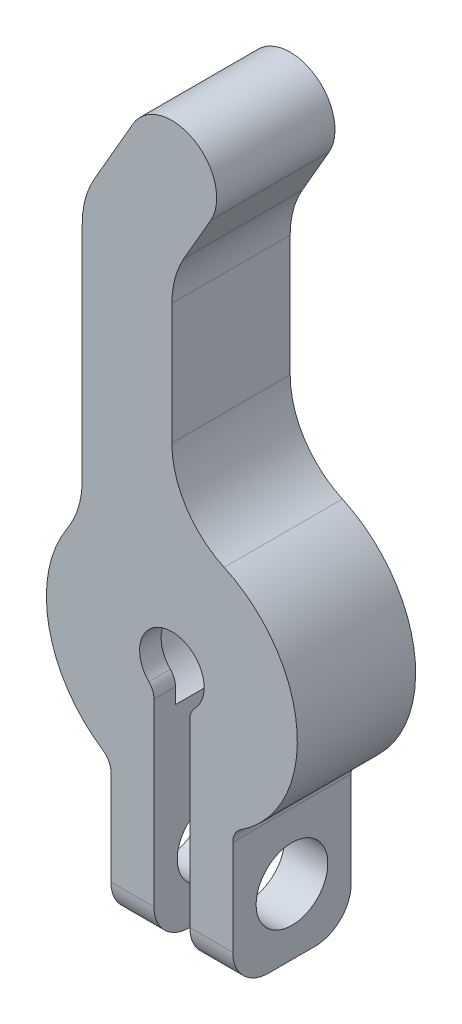
ISO-10303-21;
HEADER;
FILE_DESCRIPTION(('STEP AP214'),'2;1');
FILE_NAME('part.step','',(''),(''),'','','');
FILE_SCHEMA(('AUTOMOTIVE_DESIGN { 1 0 10303 214 1 1 1 1 }'));
ENDSEC;
DATA;
#1=APPLICATION_CONTEXT('core data for automotive mechanical design processes');
#2=APPLICATION_PROTOCOL_DEFINITION('international standard','automotive_design',2000,#1);
#3=PRODUCT_CONTEXT('',#1,'mechanical');
#4=PRODUCT('Part','Part','',(#3));
#5=PRODUCT_RELATED_PRODUCT_CATEGORY('part','',(#4));
#6=PRODUCT_DEFINITION_FORMATION('','',#4);
#7=PRODUCT_DEFINITION_CONTEXT('part definition',#1,'design');
#8=PRODUCT_DEFINITION('design','',#6,#7);
#9=PRODUCT_DEFINITION_SHAPE('','',#8);
#10=(LENGTH_UNIT() NAMED_UNIT(*) SI_UNIT(.MILLI.,.METRE.));
#11=(NAMED_UNIT(*) PLANE_ANGLE_UNIT() SI_UNIT($,.RADIAN.));
#12=(NAMED_UNIT(*) SI_UNIT($,.STERADIAN.) SOLID_ANGLE_UNIT());
#13=UNCERTAINTY_MEASURE_WITH_UNIT(LENGTH_MEASURE(1.E-05),#10,'distance_accuracy_value','');
#14=(GEOMETRIC_REPRESENTATION_CONTEXT(3) GLOBAL_UNCERTAINTY_ASSIGNED_CONTEXT((#13)) GLOBAL_UNIT_ASSIGNED_CONTEXT((#10,
#11,#12)) REPRESENTATION_CONTEXT('',''));
#15=CARTESIAN_POINT('',(0.,0.,0.));
#16=DIRECTION('',(0.,0.,1.));
#17=DIRECTION('',(1.,0.,0.));
#18=AXIS2_PLACEMENT_3D('',#15,#16,#17);
#19=CARTESIAN_POINT('',(0.,0.,2.7));
#20=DIRECTION('',(0.,0.,-1.));
#21=DIRECTION('',(-1.,0.,0.));
#22=AXIS2_PLACEMENT_3D('',#19,#20,#21);
#23=CYLINDRICAL_SURFACE('',#22,1.5);
#24=CARTESIAN_POINT('',(0.,0.,0.));
#25=DIRECTION('',(0.,0.,-1.));
#26=DIRECTION('',(1.,0.,0.));
#27=AXIS2_PLACEMENT_3D('',#24,#25,#26);
#28=CIRCLE('',#27,1.5);
#29=CARTESIAN_POINT('',(-0.5,-1.4142135623731,0.));
#30=VERTEX_POINT('',#29);
#31=CARTESIAN_POINT('',(0.5,-1.4142135623731,0.));
#32=VERTEX_POINT('',#31);
#33=EDGE_CURVE('E273',#30,#32,#28,.T.);
#34=ORIENTED_EDGE('',*,*,#33,.T.);
#35=DIRECTION('',(0.,0.,-1.));
#36=VECTOR('',#35,1.);
#37=CARTESIAN_POINT('',(0.5,-1.4142135623731,2.7));
#38=LINE('',#37,#36);
#39=CARTESIAN_POINT('',(0.5,-1.4142135623731,2.7));
#40=VERTEX_POINT('',#39);
#41=EDGE_CURVE('E329',#40,#32,#38,.T.);
#42=ORIENTED_EDGE('',*,*,#41,.F.);
#43=CARTESIAN_POINT('',(0.,0.,2.7));
#44=DIRECTION('',(0.,0.,-1.));
#45=DIRECTION('',(1.,0.,0.));
#46=AXIS2_PLACEMENT_3D('',#43,#44,#45);
#47=CIRCLE('',#46,1.5);
#48=CARTESIAN_POINT('',(-0.5,-1.4142135623731,2.7));
#49=VERTEX_POINT('',#48);
#50=EDGE_CURVE('E284',#49,#40,#47,.T.);
#51=ORIENTED_EDGE('',*,*,#50,.F.);
#52=DIRECTION('',(0.,0.,-1.));
#53=VECTOR('',#52,1.);
#54=CARTESIAN_POINT('',(-0.5,-1.4142135623731,2.7));
#55=LINE('',#54,#53);
#56=EDGE_CURVE('E287',#49,#30,#55,.T.);
#57=ORIENTED_EDGE('',*,*,#56,.T.);
#58=EDGE_LOOP('',(#34,#42,#51,#57));
#59=FACE_BOUND('',#58,.T.);
#60=ADVANCED_FACE('F38',(#59),#23,.F.);
#61=CARTESIAN_POINT('',(0.5,-1.4142135623731,2.7));
#62=DIRECTION('',(1.,0.,0.));
#63=DIRECTION('',(0.,1.,0.));
#64=AXIS2_PLACEMENT_3D('',#61,#62,#63);
#65=PLANE('',#64);
#66=CARTESIAN_POINT('',(0.5,-5.17032930884901,1.65));
#67=DIRECTION('',(1.,0.,0.));
#68=DIRECTION('',(0.,1.,0.));
#69=AXIS2_PLACEMENT_3D('',#66,#67,#68);
#70=CIRCLE('',#69,1.);
#71=CARTESIAN_POINT('',(0.5,-5.17032930884901,2.65));
#72=VERTEX_POINT('',#71);
#73=EDGE_CURVE('E278',#72,#72,#70,.T.);
#74=ORIENTED_EDGE('',*,*,#73,.T.);
#75=EDGE_LOOP('',(#74));
#76=FACE_BOUND('',#75,.T.);
#77=DIRECTION('',(0.,-1.,0.));
#78=VECTOR('',#77,1.);
#79=CARTESIAN_POINT('',(0.5,-1.4142135623731,0.));
#80=LINE('',#79,#78);
#81=CARTESIAN_POINT('',(0.500000000000001,-6.,0.));
#82=VERTEX_POINT('',#81);
#83=EDGE_CURVE('E291',#32,#82,#80,.T.);
#84=ORIENTED_EDGE('',*,*,#83,.T.);
#85=CARTESIAN_POINT('',(0.500000000000001,-6.,1.));
#86=DIRECTION('',(1.,0.,0.));
#87=DIRECTION('',(0.,1.,0.));
#88=AXIS2_PLACEMENT_3D('',#85,#86,#87);
#89=CIRCLE('',#88,1.);
#90=CARTESIAN_POINT('',(0.500000000000001,-7.,1.));
#91=VERTEX_POINT('',#90);
#92=EDGE_CURVE('E422',#82,#91,#89,.F.);
#93=ORIENTED_EDGE('',*,*,#92,.T.);
#94=DIRECTION('',(0.,0.,-1.));
#95=VECTOR('',#94,1.);
#96=CARTESIAN_POINT('',(0.500000000000001,-7.,2.7));
#97=LINE('',#96,#95);
#98=CARTESIAN_POINT('',(0.500000000000001,-7.,2.3));
#99=VERTEX_POINT('',#98);
#100=EDGE_CURVE('E326',#99,#91,#97,.T.);
#101=ORIENTED_EDGE('',*,*,#100,.F.);
#102=CARTESIAN_POINT('',(0.500000000000001,-6.,2.3));
#103=DIRECTION('',(1.,0.,0.));
#104=DIRECTION('',(0.,1.,0.));
#105=AXIS2_PLACEMENT_3D('',#102,#103,#104);
#106=CIRCLE('',#105,1.);
#107=CARTESIAN_POINT('',(0.5,-6.,3.3));
#108=VERTEX_POINT('',#107);
#109=EDGE_CURVE('E420',#99,#108,#106,.F.);
#110=ORIENTED_EDGE('',*,*,#109,.T.);
#111=DIRECTION('',(0.,-1.,0.));
#112=VECTOR('',#111,1.);
#113=CARTESIAN_POINT('',(0.499999999999999,-0.748331477354789,3.3));
#114=LINE('',#113,#112);
#115=CARTESIAN_POINT('',(0.499999999999999,-0.979795897113272,3.3));
#116=VERTEX_POINT('',#115);
#117=EDGE_CURVE('E271',#116,#108,#114,.T.);
#118=ORIENTED_EDGE('',*,*,#117,.F.);
#119=DIRECTION('',(0.,0.,-1.));
#120=VECTOR('',#119,1.);
#121=CARTESIAN_POINT('',(0.5,-0.979795897113272,2.7));
#122=LINE('',#121,#120);
#123=CARTESIAN_POINT('',(0.499999999999999,-0.979795897113272,2.7));
#124=VERTEX_POINT('',#123);
#125=EDGE_CURVE('E332',#116,#124,#122,.T.);
#126=ORIENTED_EDGE('',*,*,#125,.T.);
#127=DIRECTION('',(0.,-1.,0.));
#128=VECTOR('',#127,1.);
#129=CARTESIAN_POINT('',(0.499999999999999,-0.748331477354789,2.7));
#130=LINE('',#129,#128);
#131=EDGE_CURVE('E281',#124,#40,#130,.T.);
#132=ORIENTED_EDGE('',*,*,#131,.T.);
#133=ORIENTED_EDGE('',*,*,#41,.T.);
#134=EDGE_LOOP('',(#84,#93,#101,#110,#118,#126,#132,#133));
#135=FACE_BOUND('',#134,.T.);
#136=ADVANCED_FACE('F481',(#76,#135),#65,.F.);
#137=CARTESIAN_POINT('',(0.500000000000001,-7.,2.7));
#138=DIRECTION('',(0.,1.,0.));
#139=DIRECTION('',(0.,0.,1.));
#140=AXIS2_PLACEMENT_3D('',#137,#138,#139);
#141=PLANE('',#140);
#142=ORIENTED_EDGE('',*,*,#100,.T.);
#143=DIRECTION('',(1.,0.,0.));
#144=VECTOR('',#143,1.);
#145=CARTESIAN_POINT('',(0.500000000000001,-7.,1.));
#146=LINE('',#145,#144);
#147=CARTESIAN_POINT('',(1.7,-7.,1.));
#148=VERTEX_POINT('',#147);
#149=EDGE_CURVE('E409',#91,#148,#146,.T.);
#150=ORIENTED_EDGE('',*,*,#149,.T.);
#151=DIRECTION('',(0.,0.,-1.));
#152=VECTOR('',#151,1.);
#153=CARTESIAN_POINT('',(1.7,-7.,2.7));
#154=LINE('',#153,#152);
#155=CARTESIAN_POINT('',(1.7,-7.,2.3));
#156=VERTEX_POINT('',#155);
#157=EDGE_CURVE('E247',#156,#148,#154,.T.);
#158=ORIENTED_EDGE('',*,*,#157,.F.);
#159=DIRECTION('',(1.,0.,0.));
#160=VECTOR('',#159,1.);
#161=CARTESIAN_POINT('',(0.500000000000001,-7.,2.3));
#162=LINE('',#161,#160);
#163=EDGE_CURVE('E407',#156,#99,#162,.F.);
#164=ORIENTED_EDGE('',*,*,#163,.T.);
#165=EDGE_LOOP('',(#142,#150,#158,#164));
#166=FACE_BOUND('',#165,.T.);
#167=ADVANCED_FACE('F549',(#166),#141,.F.);
#168=CARTESIAN_POINT('',(1.7,-7.,2.7));
#169=DIRECTION('',(-1.,0.,0.));
#170=DIRECTION('',(0.,0.,1.));
#171=AXIS2_PLACEMENT_3D('',#168,#169,#170);
#172=PLANE('',#171);
#173=CARTESIAN_POINT('',(1.7,-5.17032930884901,1.65));
#174=DIRECTION('',(-1.,0.,0.));
#175=DIRECTION('',(0.,0.,1.));
#176=AXIS2_PLACEMENT_3D('',#173,#174,#175);
#177=CIRCLE('',#176,1.);
#178=CARTESIAN_POINT('',(1.7,-5.17032930884901,2.65));
#179=VERTEX_POINT('',#178);
#180=EDGE_CURVE('E856',#179,#179,#177,.T.);
#181=ORIENTED_EDGE('',*,*,#180,.T.);
#182=EDGE_LOOP('',(#181));
#183=FACE_BOUND('',#182,.T.);
#184=ORIENTED_EDGE('',*,*,#157,.T.);
#185=CARTESIAN_POINT('',(1.7,-6.,1.));
#186=DIRECTION('',(-1.,0.,0.));
#187=DIRECTION('',(0.,0.,1.));
#188=AXIS2_PLACEMENT_3D('',#185,#186,#187);
#189=CIRCLE('',#188,1.);
#190=CARTESIAN_POINT('',(1.7,-6.,0.));
#191=VERTEX_POINT('',#190);
#192=EDGE_CURVE('E414',#148,#191,#189,.F.);
#193=ORIENTED_EDGE('',*,*,#192,.T.);
#194=DIRECTION('',(0.,1.,0.));
#195=VECTOR('',#194,1.);
#196=CARTESIAN_POINT('',(1.7,-7.,0.));
#197=LINE('',#196,#195);
#198=CARTESIAN_POINT('',(1.7,-3.34065861769801,0.));
#199=VERTEX_POINT('',#198);
#200=EDGE_CURVE('E294',#191,#199,#197,.T.);
#201=ORIENTED_EDGE('',*,*,#200,.T.);
#202=DIRECTION('',(0.,0.,1.));
#203=VECTOR('',#202,1.);
#204=CARTESIAN_POINT('',(1.7,-3.34065861769801,3.3));
#205=LINE('',#204,#203);
#206=CARTESIAN_POINT('',(1.7,-3.34065861769801,3.3));
#207=VERTEX_POINT('',#206);
#208=EDGE_CURVE('E390',#199,#207,#205,.T.);
#209=ORIENTED_EDGE('',*,*,#208,.T.);
#210=DIRECTION('',(0.,1.,0.));
#211=VECTOR('',#210,1.);
#212=CARTESIAN_POINT('',(1.7,-7.,3.3));
#213=LINE('',#212,#211);
#214=CARTESIAN_POINT('',(1.7,-6.,3.3));
#215=VERTEX_POINT('',#214);
#216=EDGE_CURVE('E283',#215,#207,#213,.T.);
#217=ORIENTED_EDGE('',*,*,#216,.F.);
#218=CARTESIAN_POINT('',(1.7,-6.,2.3));
#219=DIRECTION('',(-1.,0.,0.));
#220=DIRECTION('',(0.,0.,1.));
#221=AXIS2_PLACEMENT_3D('',#218,#219,#220);
#222=CIRCLE('',#221,1.);
#223=EDGE_CURVE('E412',#215,#156,#222,.F.);
#224=ORIENTED_EDGE('',*,*,#223,.T.);
#225=EDGE_LOOP('',(#184,#193,#201,#209,#217,#224));
#226=FACE_BOUND('',#225,.T.);
#227=ADVANCED_FACE('F490',(#183,#226),#172,.F.);
#228=CARTESIAN_POINT('',(0.,0.,2.7));
#229=DIRECTION('',(0.,0.,-1.));
#230=DIRECTION('',(-1.,0.,0.));
#231=AXIS2_PLACEMENT_3D('',#228,#229,#230);
#232=CYLINDRICAL_SURFACE('',#231,3.5);
#233=CARTESIAN_POINT('',(0.,0.,3.3));
#234=DIRECTION('',(0.,0.,1.));
#235=DIRECTION('',(1.,0.,0.));
#236=AXIS2_PLACEMENT_3D('',#233,#234,#235);
#237=CIRCLE('',#236,3.5);
#238=CARTESIAN_POINT('',(1.925,-2.92307629048576,3.3));
#239=VERTEX_POINT('',#238);
#240=CARTESIAN_POINT('',(1.45833333333333,3.18170770010208,3.3));
#241=VERTEX_POINT('',#240);
#242=EDGE_CURVE('E494',#239,#241,#237,.T.);
#243=ORIENTED_EDGE('',*,*,#242,.F.);
#244=DIRECTION('',(0.,0.,-1.));
#245=VECTOR('',#244,1.);
#246=CARTESIAN_POINT('',(1.925,-2.92307629048576,2.7));
#247=LINE('',#246,#245);
#248=CARTESIAN_POINT('',(1.925,-2.92307629048576,0.));
#249=VERTEX_POINT('',#248);
#250=EDGE_CURVE('E387',#239,#249,#247,.T.);
#251=ORIENTED_EDGE('',*,*,#250,.T.);
#252=CARTESIAN_POINT('',(0.,0.,0.));
#253=DIRECTION('',(0.,0.,1.));
#254=DIRECTION('',(1.,0.,0.));
#255=AXIS2_PLACEMENT_3D('',#252,#253,#254);
#256=CIRCLE('',#255,3.5);
#257=CARTESIAN_POINT('',(1.45833333333333,3.18170770010208,0.));
#258=VERTEX_POINT('',#257);
#259=EDGE_CURVE('E296',#249,#258,#256,.T.);
#260=ORIENTED_EDGE('',*,*,#259,.T.);
#261=DIRECTION('',(0.,0.,-1.));
#262=VECTOR('',#261,1.);
#263=CARTESIAN_POINT('',(1.45833333333333,3.18170770010208,2.7));
#264=LINE('',#263,#262);
#265=EDGE_CURVE('E372',#258,#241,#264,.F.);
#266=ORIENTED_EDGE('',*,*,#265,.T.);
#267=EDGE_LOOP('',(#243,#251,#260,#266));
#268=FACE_BOUND('',#267,.T.);
#269=ADVANCED_FACE('F573',(#268),#232,.T.);
#270=CARTESIAN_POINT('',(0.,9.50000000000001,2.7));
#271=DIRECTION('',(-1.,0.,0.));
#272=DIRECTION('',(0.,0.,1.));
#273=AXIS2_PLACEMENT_3D('',#270,#271,#272);
#274=PLANE('',#273);
#275=DIRECTION('',(0.,1.,0.));
#276=VECTOR('',#275,1.);
#277=CARTESIAN_POINT('',(0.,9.50000000000001,0.));
#278=LINE('',#277,#276);
#279=CARTESIAN_POINT('',(0.,5.45435605731786,0.));
#280=VERTEX_POINT('',#279);
#281=CARTESIAN_POINT('',(0.,8.8301270189222,0.));
#282=VERTEX_POINT('',#281);
#283=EDGE_CURVE('E298',#280,#282,#278,.T.);
#284=ORIENTED_EDGE('',*,*,#283,.T.);
#285=DIRECTION('',(0.,0.,-1.));
#286=VECTOR('',#285,1.);
#287=CARTESIAN_POINT('',(0.,8.8301270189222,3.3));
#288=LINE('',#287,#286);
#289=CARTESIAN_POINT('',(0.,8.8301270189222,3.3));
#290=VERTEX_POINT('',#289);
#291=EDGE_CURVE('E367',#282,#290,#288,.F.);
#292=ORIENTED_EDGE('',*,*,#291,.T.);
#293=DIRECTION('',(0.,1.,0.));
#294=VECTOR('',#293,1.);
#295=CARTESIAN_POINT('',(0.,3.5,3.3));
#296=LINE('',#295,#294);
#297=CARTESIAN_POINT('',(0.,5.45435605731786,3.3));
#298=VERTEX_POINT('',#297);
#299=EDGE_CURVE('E238',#298,#290,#296,.T.);
#300=ORIENTED_EDGE('',*,*,#299,.F.);
#301=DIRECTION('',(0.,0.,1.));
#302=VECTOR('',#301,1.);
#303=CARTESIAN_POINT('',(0.,5.45435605731786,0.));
#304=LINE('',#303,#302);
#305=EDGE_CURVE('E364',#298,#280,#304,.F.);
#306=ORIENTED_EDGE('',*,*,#305,.T.);
#307=EDGE_LOOP('',(#284,#292,#300,#306));
#308=FACE_BOUND('',#307,.T.);
#309=ADVANCED_FACE('F569',(#308),#274,.F.);
#310=CARTESIAN_POINT('',(1.08253175473055,11.375,2.7));
#311=DIRECTION('',(-0.866025403784438,0.500000000000001,0.));
#312=DIRECTION('',(-0.500000000000001,-0.866025403784438,0.));
#313=AXIS2_PLACEMENT_3D('',#310,#311,#312);
#314=PLANE('',#313);
#315=DIRECTION('',(0.500000000000001,0.866025403784438,0.));
#316=VECTOR('',#315,1.);
#317=CARTESIAN_POINT('',(0.,9.50000000000001,3.3));
#318=LINE('',#317,#316);
#319=CARTESIAN_POINT('',(0.334936490538905,10.0801270189222,3.3));
#320=VERTEX_POINT('',#319);
#321=CARTESIAN_POINT('',(1.08253175473055,11.375,3.3));
#322=VERTEX_POINT('',#321);
#323=EDGE_CURVE('E224',#320,#322,#318,.T.);
#324=ORIENTED_EDGE('',*,*,#323,.F.);
#325=DIRECTION('',(0.,0.,-1.));
#326=VECTOR('',#325,1.);
#327=CARTESIAN_POINT('',(0.334936490538904,10.0801270189222,0.));
#328=LINE('',#327,#326);
#329=CARTESIAN_POINT('',(0.334936490538905,10.0801270189222,0.));
#330=VERTEX_POINT('',#329);
#331=EDGE_CURVE('E362',#320,#330,#328,.T.);
#332=ORIENTED_EDGE('',*,*,#331,.T.);
#333=DIRECTION('',(0.500000000000001,0.866025403784438,0.));
#334=VECTOR('',#333,1.);
#335=CARTESIAN_POINT('',(1.08253175473055,11.375,0.));
#336=LINE('',#335,#334);
#337=CARTESIAN_POINT('',(1.08253175473055,11.375,0.));
#338=VERTEX_POINT('',#337);
#339=EDGE_CURVE('E244',#330,#338,#336,.T.);
#340=ORIENTED_EDGE('',*,*,#339,.T.);
#341=DIRECTION('',(0.,0.,-1.));
#342=VECTOR('',#341,1.);
#343=CARTESIAN_POINT('',(1.08253175473055,11.375,2.7));
#344=LINE('',#343,#342);
#345=EDGE_CURVE('E241',#322,#338,#344,.T.);
#346=ORIENTED_EDGE('',*,*,#345,.F.);
#347=EDGE_LOOP('',(#324,#332,#340,#346));
#348=FACE_BOUND('',#347,.T.);
#349=ADVANCED_FACE('F242',(#348),#314,.F.);
#350=CARTESIAN_POINT('',(0.,12.,2.7));
#351=DIRECTION('',(0.,0.,-1.));
#352=DIRECTION('',(-1.,0.,0.));
#353=AXIS2_PLACEMENT_3D('',#350,#351,#352);
#354=CYLINDRICAL_SURFACE('',#353,1.25);
#355=CARTESIAN_POINT('',(0.,12.,0.));
#356=DIRECTION('',(0.,0.,1.));
#357=DIRECTION('',(1.,0.,0.));
#358=AXIS2_PLACEMENT_3D('',#355,#356,#357);
#359=CIRCLE('',#358,1.25);
#360=CARTESIAN_POINT('',(-1.08253175473055,12.625,0.));
#361=VERTEX_POINT('',#360);
#362=EDGE_CURVE('E302',#338,#361,#359,.T.);
#363=ORIENTED_EDGE('',*,*,#362,.T.);
#364=DIRECTION('',(0.,0.,-1.));
#365=VECTOR('',#364,1.);
#366=CARTESIAN_POINT('',(-1.08253175473055,12.625,2.7));
#367=LINE('',#366,#365);
#368=CARTESIAN_POINT('',(-1.08253175473055,12.625,3.3));
#369=VERTEX_POINT('',#368);
#370=EDGE_CURVE('E248',#369,#361,#367,.T.);
#371=ORIENTED_EDGE('',*,*,#370,.F.);
#372=CARTESIAN_POINT('',(0.,12.,3.3));
#373=DIRECTION('',(0.,0.,1.));
#374=DIRECTION('',(1.,0.,0.));
#375=AXIS2_PLACEMENT_3D('',#372,#373,#374);
#376=CIRCLE('',#375,1.25);
#377=EDGE_CURVE('E230',#322,#369,#376,.T.);
#378=ORIENTED_EDGE('',*,*,#377,.F.);
#379=ORIENTED_EDGE('',*,*,#345,.T.);
#380=EDGE_LOOP('',(#363,#371,#378,#379));
#381=FACE_BOUND('',#380,.T.);
#382=ADVANCED_FACE('F250',(#381),#354,.T.);
#383=CARTESIAN_POINT('',(-1.08253175473055,12.625,2.7));
#384=DIRECTION('',(0.866025403784438,-0.500000000000001,0.));
#385=DIRECTION('',(0.500000000000001,0.866025403784438,0.));
#386=AXIS2_PLACEMENT_3D('',#383,#384,#385);
#387=PLANE('',#386);
#388=DIRECTION('',(-0.500000000000001,-0.866025403784438,0.));
#389=VECTOR('',#388,1.);
#390=CARTESIAN_POINT('',(-1.08253175473055,12.625,0.));
#391=LINE('',#390,#389);
#392=CARTESIAN_POINT('',(-2.1650635094611,10.75,0.));
#393=VERTEX_POINT('',#392);
#394=EDGE_CURVE('E304',#361,#393,#391,.T.);
#395=ORIENTED_EDGE('',*,*,#394,.T.);
#396=DIRECTION('',(0.,0.,-1.));
#397=VECTOR('',#396,1.);
#398=CARTESIAN_POINT('',(-2.1650635094611,10.75,2.7));
#399=LINE('',#398,#397);
#400=CARTESIAN_POINT('',(-2.1650635094611,10.75,3.3));
#401=VERTEX_POINT('',#400);
#402=EDGE_CURVE('E358',#393,#401,#399,.F.);
#403=ORIENTED_EDGE('',*,*,#402,.T.);
#404=DIRECTION('',(-0.500000000000001,-0.866025403784438,0.));
#405=VECTOR('',#404,1.);
#406=CARTESIAN_POINT('',(-1.08253175473055,12.625,3.3));
#407=LINE('',#406,#405);
#408=EDGE_CURVE('E252',#369,#401,#407,.T.);
#409=ORIENTED_EDGE('',*,*,#408,.F.);
#410=ORIENTED_EDGE('',*,*,#370,.T.);
#411=EDGE_LOOP('',(#395,#403,#409,#410));
#412=FACE_BOUND('',#411,.T.);
#413=ADVANCED_FACE('F509',(#412),#387,.F.);
#414=CARTESIAN_POINT('',(-2.5,10.1698729810778,2.7));
#415=DIRECTION('',(1.,0.,0.));
#416=DIRECTION('',(0.,1.,0.));
#417=AXIS2_PLACEMENT_3D('',#414,#415,#416);
#418=PLANE('',#417);
#419=DIRECTION('',(0.,-1.,0.));
#420=VECTOR('',#419,1.);
#421=CARTESIAN_POINT('',(-2.5,10.1698729810778,3.3));
#422=LINE('',#421,#420);
#423=CARTESIAN_POINT('',(-2.5,9.50000000000001,3.3));
#424=VERTEX_POINT('',#423);
#425=CARTESIAN_POINT('',(-2.5,3.3166247903554,3.3));
#426=VERTEX_POINT('',#425);
#427=EDGE_CURVE('E254',#424,#426,#422,.T.);
#428=ORIENTED_EDGE('',*,*,#427,.F.);
#429=DIRECTION('',(0.,0.,-1.));
#430=VECTOR('',#429,1.);
#431=CARTESIAN_POINT('',(-2.5,9.50000000000001,2.7));
#432=LINE('',#431,#430);
#433=CARTESIAN_POINT('',(-2.5,9.50000000000001,0.));
#434=VERTEX_POINT('',#433);
#435=EDGE_CURVE('E353',#424,#434,#432,.T.);
#436=ORIENTED_EDGE('',*,*,#435,.T.);
#437=DIRECTION('',(0.,-1.,0.));
#438=VECTOR('',#437,1.);
#439=CARTESIAN_POINT('',(-2.5,10.1698729810778,0.));
#440=LINE('',#439,#438);
#441=CARTESIAN_POINT('',(-2.5,3.3166247903554,0.));
#442=VERTEX_POINT('',#441);
#443=EDGE_CURVE('E307',#434,#442,#440,.T.);
#444=ORIENTED_EDGE('',*,*,#443,.T.);
#445=DIRECTION('',(0.,0.,1.));
#446=VECTOR('',#445,1.);
#447=CARTESIAN_POINT('',(-2.5,3.3166247903554,3.3));
#448=LINE('',#447,#446);
#449=EDGE_CURVE('E351',#442,#426,#448,.T.);
#450=ORIENTED_EDGE('',*,*,#449,.T.);
#451=EDGE_LOOP('',(#428,#436,#444,#450));
#452=FACE_BOUND('',#451,.T.);
#453=ADVANCED_FACE('F518',(#452),#418,.F.);
#454=CARTESIAN_POINT('',(0.,0.,2.7));
#455=DIRECTION('',(0.,0.,-1.));
#456=DIRECTION('',(-1.,0.,0.));
#457=AXIS2_PLACEMENT_3D('',#454,#455,#456);
#458=CYLINDRICAL_SURFACE('',#457,3.5);
#459=CARTESIAN_POINT('',(0.,0.,0.));
#460=DIRECTION('',(0.,0.,1.));
#461=DIRECTION('',(1.,0.,0.));
#462=AXIS2_PLACEMENT_3D('',#459,#460,#461);
#463=CIRCLE('',#462,3.5);
#464=CARTESIAN_POINT('',(-2.91666666666667,1.93469779437398,0.));
#465=VERTEX_POINT('',#464);
#466=CARTESIAN_POINT('',(-1.925,-2.92307629048576,0.));
#467=VERTEX_POINT('',#466);
#468=EDGE_CURVE('E310',#465,#467,#463,.T.);
#469=ORIENTED_EDGE('',*,*,#468,.T.);
#470=DIRECTION('',(0.,0.,-1.));
#471=VECTOR('',#470,1.);
#472=CARTESIAN_POINT('',(-1.925,-2.92307629048576,2.7));
#473=LINE('',#472,#471);
#474=CARTESIAN_POINT('',(-1.925,-2.92307629048576,3.3));
#475=VERTEX_POINT('',#474);
#476=EDGE_CURVE('E396',#467,#475,#473,.F.);
#477=ORIENTED_EDGE('',*,*,#476,.T.);
#478=CARTESIAN_POINT('',(0.,0.,3.3));
#479=DIRECTION('',(0.,0.,1.));
#480=DIRECTION('',(1.,0.,0.));
#481=AXIS2_PLACEMENT_3D('',#478,#479,#480);
#482=CIRCLE('',#481,3.5);
#483=CARTESIAN_POINT('',(-2.91666666666667,1.93469779437398,3.3));
#484=VERTEX_POINT('',#483);
#485=EDGE_CURVE('E260',#484,#475,#482,.T.);
#486=ORIENTED_EDGE('',*,*,#485,.F.);
#487=DIRECTION('',(0.,0.,-1.));
#488=VECTOR('',#487,1.);
#489=CARTESIAN_POINT('',(-2.91666666666667,1.93469779437398,2.7));
#490=LINE('',#489,#488);
#491=EDGE_CURVE('E369',#484,#465,#490,.T.);
#492=ORIENTED_EDGE('',*,*,#491,.T.);
#493=EDGE_LOOP('',(#469,#477,#486,#492));
#494=FACE_BOUND('',#493,.T.);
#495=ADVANCED_FACE('F527',(#494),#458,.T.);
#496=CARTESIAN_POINT('',(-1.7,-7.,2.7));
#497=DIRECTION('',(1.,0.,0.));
#498=DIRECTION('',(0.,0.,-1.));
#499=AXIS2_PLACEMENT_3D('',#496,#497,#498);
#500=PLANE('',#499);
#501=CARTESIAN_POINT('',(-1.7,-5.17032930884901,1.65));
#502=DIRECTION('',(-1.,0.,0.));
#503=DIRECTION('',(0.,0.,1.));
#504=AXIS2_PLACEMENT_3D('',#501,#502,#503);
#505=CIRCLE('',#504,1.);
#506=CARTESIAN_POINT('',(-1.7,-5.17032930884901,2.65));
#507=VERTEX_POINT('',#506);
#508=EDGE_CURVE('E860',#507,#507,#505,.T.);
#509=ORIENTED_EDGE('',*,*,#508,.F.);
#510=EDGE_LOOP('',(#509));
#511=FACE_BOUND('',#510,.T.);
#512=DIRECTION('',(0.,-1.,0.));
#513=VECTOR('',#512,1.);
#514=CARTESIAN_POINT('',(-1.7,-7.,0.));
#515=LINE('',#514,#513);
#516=CARTESIAN_POINT('',(-1.7,-3.34065861769801,0.));
#517=VERTEX_POINT('',#516);
#518=CARTESIAN_POINT('',(-1.7,-6.,0.));
#519=VERTEX_POINT('',#518);
#520=EDGE_CURVE('E313',#517,#519,#515,.T.);
#521=ORIENTED_EDGE('',*,*,#520,.T.);
#522=CARTESIAN_POINT('',(-1.7,-6.,1.));
#523=DIRECTION('',(1.,0.,0.));
#524=DIRECTION('',(0.,0.,-1.));
#525=AXIS2_PLACEMENT_3D('',#522,#523,#524);
#526=CIRCLE('',#525,1.);
#527=CARTESIAN_POINT('',(-1.7,-7.,1.));
#528=VERTEX_POINT('',#527);
#529=EDGE_CURVE('E11',#519,#528,#526,.F.);
#530=ORIENTED_EDGE('',*,*,#529,.T.);
#531=DIRECTION('',(0.,0.,-1.));
#532=VECTOR('',#531,1.);
#533=CARTESIAN_POINT('',(-1.7,-7.,2.7));
#534=LINE('',#533,#532);
#535=CARTESIAN_POINT('',(-1.7,-7.,2.3));
#536=VERTEX_POINT('',#535);
#537=EDGE_CURVE('E321',#536,#528,#534,.T.);
#538=ORIENTED_EDGE('',*,*,#537,.F.);
#539=CARTESIAN_POINT('',(-1.7,-6.,2.3));
#540=DIRECTION('',(1.,0.,0.));
#541=DIRECTION('',(0.,0.,-1.));
#542=AXIS2_PLACEMENT_3D('',#539,#540,#541);
#543=CIRCLE('',#542,1.);
#544=CARTESIAN_POINT('',(-1.7,-6.,3.3));
#545=VERTEX_POINT('',#544);
#546=EDGE_CURVE('E47',#536,#545,#543,.F.);
#547=ORIENTED_EDGE('',*,*,#546,.T.);
#548=DIRECTION('',(0.,-1.,0.));
#549=VECTOR('',#548,1.);
#550=CARTESIAN_POINT('',(-1.7,-3.05941170815567,3.3));
#551=LINE('',#550,#549);
#552=CARTESIAN_POINT('',(-1.7,-3.34065861769801,3.3));
#553=VERTEX_POINT('',#552);
#554=EDGE_CURVE('E263',#553,#545,#551,.T.);
#555=ORIENTED_EDGE('',*,*,#554,.F.);
#556=DIRECTION('',(0.,0.,1.));
#557=VECTOR('',#556,1.);
#558=CARTESIAN_POINT('',(-1.7,-3.34065861769801,0.));
#559=LINE('',#558,#557);
#560=EDGE_CURVE('E393',#553,#517,#559,.F.);
#561=ORIENTED_EDGE('',*,*,#560,.T.);
#562=EDGE_LOOP('',(#521,#530,#538,#547,#555,#561));
#563=FACE_BOUND('',#562,.T.);
#564=ADVANCED_FACE('F440',(#511,#563),#500,.F.);
#565=CARTESIAN_POINT('',(-0.500000000000001,-7.,2.7));
#566=DIRECTION('',(0.,1.,0.));
#567=DIRECTION('',(0.,0.,1.));
#568=AXIS2_PLACEMENT_3D('',#565,#566,#567);
#569=PLANE('',#568);
#570=ORIENTED_EDGE('',*,*,#537,.T.);
#571=DIRECTION('',(1.,0.,0.));
#572=VECTOR('',#571,1.);
#573=CARTESIAN_POINT('',(-0.500000000000001,-7.,1.));
#574=LINE('',#573,#572);
#575=CARTESIAN_POINT('',(-0.500000000000001,-7.,1.));
#576=VERTEX_POINT('',#575);
#577=EDGE_CURVE('E431',#528,#576,#574,.T.);
#578=ORIENTED_EDGE('',*,*,#577,.T.);
#579=DIRECTION('',(0.,0.,-1.));
#580=VECTOR('',#579,1.);
#581=CARTESIAN_POINT('',(-0.500000000000001,-7.,2.7));
#582=LINE('',#581,#580);
#583=CARTESIAN_POINT('',(-0.500000000000001,-7.,2.3));
#584=VERTEX_POINT('',#583);
#585=EDGE_CURVE('E318',#584,#576,#582,.T.);
#586=ORIENTED_EDGE('',*,*,#585,.F.);
#587=DIRECTION('',(1.,0.,0.));
#588=VECTOR('',#587,1.);
#589=CARTESIAN_POINT('',(-1.7,-7.,2.3));
#590=LINE('',#589,#588);
#591=EDGE_CURVE('E59',#584,#536,#590,.F.);
#592=ORIENTED_EDGE('',*,*,#591,.T.);
#593=EDGE_LOOP('',(#570,#578,#586,#592));
#594=FACE_BOUND('',#593,.T.);
#595=ADVANCED_FACE('F448',(#594),#569,.F.);
#596=CARTESIAN_POINT('',(-0.5,-1.4142135623731,2.7));
#597=DIRECTION('',(-1.,0.,0.));
#598=DIRECTION('',(0.,-1.,0.));
#599=AXIS2_PLACEMENT_3D('',#596,#597,#598);
#600=PLANE('',#599);
#601=CARTESIAN_POINT('',(-0.500000000000001,-5.17032930884901,1.65));
#602=DIRECTION('',(-1.,0.,0.));
#603=DIRECTION('',(0.,-1.,0.));
#604=AXIS2_PLACEMENT_3D('',#601,#602,#603);
#605=CIRCLE('',#604,1.);
#606=CARTESIAN_POINT('',(-0.500000000000001,-6.17032930884901,1.65));
#607=VERTEX_POINT('',#606);
#608=EDGE_CURVE('E42',#607,#607,#605,.T.);
#609=ORIENTED_EDGE('',*,*,#608,.T.);
#610=EDGE_LOOP('',(#609));
#611=FACE_BOUND('',#610,.T.);
#612=ORIENTED_EDGE('',*,*,#585,.T.);
#613=CARTESIAN_POINT('',(-0.500000000000001,-6.,1.));
#614=DIRECTION('',(-1.,0.,0.));
#615=DIRECTION('',(0.,-1.,0.));
#616=AXIS2_PLACEMENT_3D('',#613,#614,#615);
#617=CIRCLE('',#616,1.);
#618=CARTESIAN_POINT('',(-0.500000000000001,-6.,0.));
#619=VERTEX_POINT('',#618);
#620=EDGE_CURVE('E436',#576,#619,#617,.F.);
#621=ORIENTED_EDGE('',*,*,#620,.T.);
#622=DIRECTION('',(0.,1.,0.));
#623=VECTOR('',#622,1.);
#624=CARTESIAN_POINT('',(-0.5,-1.4142135623731,0.));
#625=LINE('',#624,#623);
#626=EDGE_CURVE('E288',#619,#30,#625,.T.);
#627=ORIENTED_EDGE('',*,*,#626,.T.);
#628=ORIENTED_EDGE('',*,*,#56,.F.);
#629=DIRECTION('',(0.,1.,0.));
#630=VECTOR('',#629,1.);
#631=CARTESIAN_POINT('',(-0.500000000000001,-7.,2.7));
#632=LINE('',#631,#630);
#633=CARTESIAN_POINT('',(-0.500000000000002,-0.979795897113272,2.7));
#634=VERTEX_POINT('',#633);
#635=EDGE_CURVE('E274',#49,#634,#632,.T.);
#636=ORIENTED_EDGE('',*,*,#635,.T.);
#637=DIRECTION('',(0.,0.,-1.));
#638=VECTOR('',#637,1.);
#639=CARTESIAN_POINT('',(-0.5,-0.979795897113272,2.7));
#640=LINE('',#639,#638);
#641=CARTESIAN_POINT('',(-0.500000000000002,-0.979795897113272,3.3));
#642=VERTEX_POINT('',#641);
#643=EDGE_CURVE('E348',#634,#642,#640,.F.);
#644=ORIENTED_EDGE('',*,*,#643,.T.);
#645=DIRECTION('',(0.,1.,0.));
#646=VECTOR('',#645,1.);
#647=CARTESIAN_POINT('',(-0.500000000000001,-7.,3.3));
#648=LINE('',#647,#646);
#649=CARTESIAN_POINT('',(-0.500000000000001,-6.,3.3));
#650=VERTEX_POINT('',#649);
#651=EDGE_CURVE('E266',#650,#642,#648,.T.);
#652=ORIENTED_EDGE('',*,*,#651,.F.);
#653=CARTESIAN_POINT('',(-0.500000000000001,-6.,2.3));
#654=DIRECTION('',(-1.,0.,0.));
#655=DIRECTION('',(0.,-1.,0.));
#656=AXIS2_PLACEMENT_3D('',#653,#654,#655);
#657=CIRCLE('',#656,1.);
#658=EDGE_CURVE('E434',#650,#584,#657,.F.);
#659=ORIENTED_EDGE('',*,*,#658,.T.);
#660=EDGE_LOOP('',(#612,#621,#627,#628,#636,#644,#652,#659));
#661=FACE_BOUND('',#660,.T.);
#662=ADVANCED_FACE('F447',(#611,#661),#600,.F.);
#663=CARTESIAN_POINT('',(0.,0.,0.));
#664=DIRECTION('',(0.,0.,1.));
#665=DIRECTION('',(1.,0.,0.));
#666=AXIS2_PLACEMENT_3D('',#663,#664,#665);
#667=PLANE('',#666);
#668=ORIENTED_EDGE('',*,*,#200,.F.);
#669=DIRECTION('',(1.,0.,0.));
#670=VECTOR('',#669,1.);
#671=CARTESIAN_POINT('',(0.,-6.,0.));
#672=LINE('',#671,#670);
#673=EDGE_CURVE('E418',#191,#82,#672,.F.);
#674=ORIENTED_EDGE('',*,*,#673,.T.);
#675=ORIENTED_EDGE('',*,*,#83,.F.);
#676=ORIENTED_EDGE('',*,*,#33,.F.);
#677=ORIENTED_EDGE('',*,*,#626,.F.);
#678=DIRECTION('',(1.,0.,0.));
#679=VECTOR('',#678,1.);
#680=CARTESIAN_POINT('',(0.,-6.,0.));
#681=LINE('',#680,#679);
#682=EDGE_CURVE('E416',#619,#519,#681,.F.);
#683=ORIENTED_EDGE('',*,*,#682,.T.);
#684=ORIENTED_EDGE('',*,*,#520,.F.);
#685=CARTESIAN_POINT('',(-2.2,-3.34065861769801,0.));
#686=DIRECTION('',(0.,0.,1.));
#687=DIRECTION('',(1.,0.,0.));
#688=AXIS2_PLACEMENT_3D('',#685,#686,#687);
#689=CIRCLE('',#688,0.5);
#690=EDGE_CURVE('E403',#517,#467,#689,.T.);
#691=ORIENTED_EDGE('',*,*,#690,.T.);
#692=ORIENTED_EDGE('',*,*,#468,.F.);
#693=CARTESIAN_POINT('',(-5.,3.3166247903554,0.));
#694=DIRECTION('',(0.,0.,1.));
#695=DIRECTION('',(1.,0.,0.));
#696=AXIS2_PLACEMENT_3D('',#693,#694,#695);
#697=CIRCLE('',#696,2.5);
#698=EDGE_CURVE('E378',#465,#442,#697,.T.);
#699=ORIENTED_EDGE('',*,*,#698,.T.);
#700=ORIENTED_EDGE('',*,*,#443,.F.);
#701=CARTESIAN_POINT('',(0.,9.50000000000001,0.));
#702=DIRECTION('',(0.,0.,1.));
#703=DIRECTION('',(1.,0.,0.));
#704=AXIS2_PLACEMENT_3D('',#701,#702,#703);
#705=CIRCLE('',#704,2.5);
#706=EDGE_CURVE('E356',#434,#393,#705,.F.);
#707=ORIENTED_EDGE('',*,*,#706,.T.);
#708=ORIENTED_EDGE('',*,*,#394,.F.);
#709=ORIENTED_EDGE('',*,*,#362,.F.);
#710=ORIENTED_EDGE('',*,*,#339,.F.);
#711=CARTESIAN_POINT('',(2.5,8.8301270189222,0.));
#712=DIRECTION('',(0.,0.,1.));
#713=DIRECTION('',(1.,0.,0.));
#714=AXIS2_PLACEMENT_3D('',#711,#712,#713);
#715=CIRCLE('',#714,2.5);
#716=EDGE_CURVE('E375',#330,#282,#715,.T.);
#717=ORIENTED_EDGE('',*,*,#716,.T.);
#718=ORIENTED_EDGE('',*,*,#283,.F.);
#719=CARTESIAN_POINT('',(2.5,5.45435605731786,0.));
#720=DIRECTION('',(0.,0.,1.));
#721=DIRECTION('',(1.,0.,0.));
#722=AXIS2_PLACEMENT_3D('',#719,#720,#721);
#723=CIRCLE('',#722,2.5);
#724=EDGE_CURVE('E382',#280,#258,#723,.T.);
#725=ORIENTED_EDGE('',*,*,#724,.T.);
#726=ORIENTED_EDGE('',*,*,#259,.F.);
#727=CARTESIAN_POINT('',(2.2,-3.34065861769801,0.));
#728=DIRECTION('',(0.,0.,1.));
#729=DIRECTION('',(1.,0.,0.));
#730=AXIS2_PLACEMENT_3D('',#727,#728,#729);
#731=CIRCLE('',#730,0.5);
#732=EDGE_CURVE('E398',#249,#199,#731,.T.);
#733=ORIENTED_EDGE('',*,*,#732,.T.);
#734=EDGE_LOOP('',(#668,#674,#675,#676,#677,#683,#684,#691,#692,#699,#700,#707,#708,#709,#710,
#717,#718,#725,#726,#733));
#735=FACE_BOUND('',#734,.T.);
#736=ADVANCED_FACE('F457',(#735),#667,.F.);
#737=CARTESIAN_POINT('',(0.,0.,2.7));
#738=DIRECTION('',(0.,0.,1.));
#739=DIRECTION('',(1.,0.,0.));
#740=AXIS2_PLACEMENT_3D('',#737,#738,#739);
#741=PLANE('',#740);
#742=ORIENTED_EDGE('',*,*,#131,.F.);
#743=CARTESIAN_POINT('',(0.999999999999999,-0.979795897113272,2.7));
#744=DIRECTION('',(0.,0.,1.));
#745=DIRECTION('',(1.,0.,0.));
#746=AXIS2_PLACEMENT_3D('',#743,#744,#745);
#747=CIRCLE('',#746,0.5);
#748=CARTESIAN_POINT('',(0.642857142857142,-0.629868791001389,2.7));
#749=VERTEX_POINT('',#748);
#750=EDGE_CURVE('E337',#124,#749,#747,.F.);
#751=ORIENTED_EDGE('',*,*,#750,.T.);
#752=CARTESIAN_POINT('',(0.,0.,2.7));
#753=DIRECTION('',(0.,0.,-1.));
#754=DIRECTION('',(1.,0.,0.));
#755=AXIS2_PLACEMENT_3D('',#752,#753,#754);
#756=CIRCLE('',#755,0.9);
#757=CARTESIAN_POINT('',(-0.642857142857142,-0.629868791001389,2.7));
#758=VERTEX_POINT('',#757);
#759=EDGE_CURVE('E277',#758,#749,#756,.T.);
#760=ORIENTED_EDGE('',*,*,#759,.F.);
#761=CARTESIAN_POINT('',(-0.999999999999999,-0.979795897113272,2.7));
#762=DIRECTION('',(0.,0.,1.));
#763=DIRECTION('',(1.,0.,0.));
#764=AXIS2_PLACEMENT_3D('',#761,#762,#763);
#765=CIRCLE('',#764,0.5);
#766=EDGE_CURVE('E335',#758,#634,#765,.F.);
#767=ORIENTED_EDGE('',*,*,#766,.T.);
#768=ORIENTED_EDGE('',*,*,#635,.F.);
#769=ORIENTED_EDGE('',*,*,#50,.T.);
#770=EDGE_LOOP('',(#742,#751,#760,#767,#768,#769));
#771=FACE_BOUND('',#770,.T.);
#772=ADVANCED_FACE('F592',(#771),#741,.F.);
#773=CARTESIAN_POINT('',(0.,0.,3.3));
#774=DIRECTION('',(0.,0.,-1.));
#775=DIRECTION('',(-1.,0.,0.));
#776=AXIS2_PLACEMENT_3D('',#773,#774,#775);
#777=CYLINDRICAL_SURFACE('',#776,0.9);
#778=ORIENTED_EDGE('',*,*,#759,.T.);
#779=DIRECTION('',(0.,0.,-1.));
#780=VECTOR('',#779,1.);
#781=CARTESIAN_POINT('',(0.642857142857143,-0.629868791001389,3.3));
#782=LINE('',#781,#780);
#783=CARTESIAN_POINT('',(0.642857142857142,-0.629868791001389,3.3));
#784=VERTEX_POINT('',#783);
#785=EDGE_CURVE('E342',#749,#784,#782,.F.);
#786=ORIENTED_EDGE('',*,*,#785,.T.);
#787=CARTESIAN_POINT('',(0.,0.,3.3));
#788=DIRECTION('',(0.,0.,-1.));
#789=DIRECTION('',(1.,0.,0.));
#790=AXIS2_PLACEMENT_3D('',#787,#788,#789);
#791=CIRCLE('',#790,0.9);
#792=CARTESIAN_POINT('',(-0.642857142857142,-0.629868791001389,3.3));
#793=VERTEX_POINT('',#792);
#794=EDGE_CURVE('E268',#793,#784,#791,.T.);
#795=ORIENTED_EDGE('',*,*,#794,.F.);
#796=DIRECTION('',(0.,0.,-1.));
#797=VECTOR('',#796,1.);
#798=CARTESIAN_POINT('',(-0.642857142857143,-0.629868791001389,3.3));
#799=LINE('',#798,#797);
#800=EDGE_CURVE('E339',#793,#758,#799,.T.);
#801=ORIENTED_EDGE('',*,*,#800,.T.);
#802=EDGE_LOOP('',(#778,#786,#795,#801));
#803=FACE_BOUND('',#802,.T.);
#804=ADVANCED_FACE('F472',(#803),#777,.F.);
#805=CARTESIAN_POINT('',(0.,0.,3.3));
#806=DIRECTION('',(0.,0.,1.));
#807=DIRECTION('',(1.,0.,0.));
#808=AXIS2_PLACEMENT_3D('',#805,#806,#807);
#809=PLANE('',#808);
#810=ORIENTED_EDGE('',*,*,#117,.T.);
#811=DIRECTION('',(1.,0.,0.));
#812=VECTOR('',#811,1.);
#813=CARTESIAN_POINT('',(1.7,-6.,3.3));
#814=LINE('',#813,#812);
#815=EDGE_CURVE('E427',#108,#215,#814,.T.);
#816=ORIENTED_EDGE('',*,*,#815,.T.);
#817=ORIENTED_EDGE('',*,*,#216,.T.);
#818=CARTESIAN_POINT('',(2.2,-3.34065861769801,3.3));
#819=DIRECTION('',(0.,0.,1.));
#820=DIRECTION('',(1.,0.,0.));
#821=AXIS2_PLACEMENT_3D('',#818,#819,#820);
#822=CIRCLE('',#821,0.5);
#823=EDGE_CURVE('E401',#207,#239,#822,.F.);
#824=ORIENTED_EDGE('',*,*,#823,.T.);
#825=ORIENTED_EDGE('',*,*,#242,.T.);
#826=CARTESIAN_POINT('',(2.5,5.45435605731786,3.3));
#827=DIRECTION('',(0.,0.,1.));
#828=DIRECTION('',(1.,0.,0.));
#829=AXIS2_PLACEMENT_3D('',#826,#827,#828);
#830=CIRCLE('',#829,2.5);
#831=EDGE_CURVE('E385',#241,#298,#830,.F.);
#832=ORIENTED_EDGE('',*,*,#831,.T.);
#833=ORIENTED_EDGE('',*,*,#299,.T.);
#834=CARTESIAN_POINT('',(2.5,8.8301270189222,3.3));
#835=DIRECTION('',(0.,0.,1.));
#836=DIRECTION('',(1.,0.,0.));
#837=AXIS2_PLACEMENT_3D('',#834,#835,#836);
#838=CIRCLE('',#837,2.5);
#839=EDGE_CURVE('E234',#290,#320,#838,.F.);
#840=ORIENTED_EDGE('',*,*,#839,.T.);
#841=ORIENTED_EDGE('',*,*,#323,.T.);
#842=ORIENTED_EDGE('',*,*,#377,.T.);
#843=ORIENTED_EDGE('',*,*,#408,.T.);
#844=CARTESIAN_POINT('',(0.,9.50000000000001,3.3));
#845=DIRECTION('',(0.,0.,1.));
#846=DIRECTION('',(1.,0.,0.));
#847=AXIS2_PLACEMENT_3D('',#844,#845,#846);
#848=CIRCLE('',#847,2.5);
#849=EDGE_CURVE('E360',#401,#424,#848,.T.);
#850=ORIENTED_EDGE('',*,*,#849,.T.);
#851=ORIENTED_EDGE('',*,*,#427,.T.);
#852=CARTESIAN_POINT('',(-5.,3.3166247903554,3.3));
#853=DIRECTION('',(0.,0.,1.));
#854=DIRECTION('',(1.,0.,0.));
#855=AXIS2_PLACEMENT_3D('',#852,#853,#854);
#856=CIRCLE('',#855,2.5);
#857=EDGE_CURVE('E380',#426,#484,#856,.F.);
#858=ORIENTED_EDGE('',*,*,#857,.T.);
#859=ORIENTED_EDGE('',*,*,#485,.T.);
#860=CARTESIAN_POINT('',(-2.2,-3.34065861769801,3.3));
#861=DIRECTION('',(0.,0.,1.));
#862=DIRECTION('',(1.,0.,0.));
#863=AXIS2_PLACEMENT_3D('',#860,#861,#862);
#864=CIRCLE('',#863,0.5);
#865=EDGE_CURVE('E405',#475,#553,#864,.F.);
#866=ORIENTED_EDGE('',*,*,#865,.T.);
#867=ORIENTED_EDGE('',*,*,#554,.T.);
#868=DIRECTION('',(1.,0.,0.));
#869=VECTOR('',#868,1.);
#870=CARTESIAN_POINT('',(-0.500000000000001,-6.,3.3));
#871=LINE('',#870,#869);
#872=EDGE_CURVE('E424',#545,#650,#871,.T.);
#873=ORIENTED_EDGE('',*,*,#872,.T.);
#874=ORIENTED_EDGE('',*,*,#651,.T.);
#875=CARTESIAN_POINT('',(-0.999999999999999,-0.979795897113272,3.3));
#876=DIRECTION('',(0.,0.,1.));
#877=DIRECTION('',(1.,0.,0.));
#878=AXIS2_PLACEMENT_3D('',#875,#876,#877);
#879=CIRCLE('',#878,0.5);
#880=EDGE_CURVE('E344',#642,#793,#879,.T.);
#881=ORIENTED_EDGE('',*,*,#880,.T.);
#882=ORIENTED_EDGE('',*,*,#794,.T.);
#883=CARTESIAN_POINT('',(0.999999999999999,-0.979795897113272,3.3));
#884=DIRECTION('',(0.,0.,1.));
#885=DIRECTION('',(1.,0.,0.));
#886=AXIS2_PLACEMENT_3D('',#883,#884,#885);
#887=CIRCLE('',#886,0.5);
#888=EDGE_CURVE('E346',#784,#116,#887,.T.);
#889=ORIENTED_EDGE('',*,*,#888,.T.);
#890=EDGE_LOOP('',(#810,#816,#817,#824,#825,#832,#833,#840,#841,#842,#843,#850,#851,#858,#859,
#866,#867,#873,#874,#881,#882,#889));
#891=FACE_BOUND('',#890,.T.);
#892=ADVANCED_FACE('F227',(#891),#809,.T.);
#893=CARTESIAN_POINT('',(0.999999999999999,-0.979795897113272,3.3));
#894=DIRECTION('',(0.,0.,-1.));
#895=DIRECTION('',(-1.,0.,0.));
#896=AXIS2_PLACEMENT_3D('',#893,#894,#895);
#897=CYLINDRICAL_SURFACE('',#896,0.5);
#898=ORIENTED_EDGE('',*,*,#888,.F.);
#899=ORIENTED_EDGE('',*,*,#785,.F.);
#900=ORIENTED_EDGE('',*,*,#750,.F.);
#901=ORIENTED_EDGE('',*,*,#125,.F.);
#902=EDGE_LOOP('',(#898,#899,#900,#901));
#903=FACE_BOUND('',#902,.T.);
#904=ADVANCED_FACE('F476',(#903),#897,.T.);
#905=CARTESIAN_POINT('',(-0.999999999999999,-0.979795897113272,3.3));
#906=DIRECTION('',(0.,0.,-1.));
#907=DIRECTION('',(-1.,0.,0.));
#908=AXIS2_PLACEMENT_3D('',#905,#906,#907);
#909=CYLINDRICAL_SURFACE('',#908,0.5);
#910=ORIENTED_EDGE('',*,*,#880,.F.);
#911=ORIENTED_EDGE('',*,*,#643,.F.);
#912=ORIENTED_EDGE('',*,*,#766,.F.);
#913=ORIENTED_EDGE('',*,*,#800,.F.);
#914=EDGE_LOOP('',(#910,#911,#912,#913));
#915=FACE_BOUND('',#914,.T.);
#916=ADVANCED_FACE('F467',(#915),#909,.T.);
#917=CARTESIAN_POINT('',(0.,9.50000000000001,2.7));
#918=DIRECTION('',(0.,0.,-1.));
#919=DIRECTION('',(-1.,0.,0.));
#920=AXIS2_PLACEMENT_3D('',#917,#918,#919);
#921=CYLINDRICAL_SURFACE('',#920,2.5);
#922=ORIENTED_EDGE('',*,*,#849,.F.);
#923=ORIENTED_EDGE('',*,*,#402,.F.);
#924=ORIENTED_EDGE('',*,*,#706,.F.);
#925=ORIENTED_EDGE('',*,*,#435,.F.);
#926=EDGE_LOOP('',(#922,#923,#924,#925));
#927=FACE_BOUND('',#926,.T.);
#928=ADVANCED_FACE('F515',(#927),#921,.T.);
#929=CARTESIAN_POINT('',(2.5,8.8301270189222,2.7));
#930=DIRECTION('',(0.,0.,1.));
#931=DIRECTION('',(1.,0.,0.));
#932=AXIS2_PLACEMENT_3D('',#929,#930,#931);
#933=CYLINDRICAL_SURFACE('',#932,2.5);
#934=ORIENTED_EDGE('',*,*,#839,.F.);
#935=ORIENTED_EDGE('',*,*,#291,.F.);
#936=ORIENTED_EDGE('',*,*,#716,.F.);
#937=ORIENTED_EDGE('',*,*,#331,.F.);
#938=EDGE_LOOP('',(#934,#935,#936,#937));
#939=FACE_BOUND('',#938,.T.);
#940=ADVANCED_FACE('F505',(#939),#933,.F.);
#941=CARTESIAN_POINT('',(-5.,3.3166247903554,2.7));
#942=DIRECTION('',(0.,0.,-1.));
#943=DIRECTION('',(-1.,0.,0.));
#944=AXIS2_PLACEMENT_3D('',#941,#942,#943);
#945=CYLINDRICAL_SURFACE('',#944,2.5);
#946=ORIENTED_EDGE('',*,*,#857,.F.);
#947=ORIENTED_EDGE('',*,*,#449,.F.);
#948=ORIENTED_EDGE('',*,*,#698,.F.);
#949=ORIENTED_EDGE('',*,*,#491,.F.);
#950=EDGE_LOOP('',(#946,#947,#948,#949));
#951=FACE_BOUND('',#950,.T.);
#952=ADVANCED_FACE('F524',(#951),#945,.F.);
#953=CARTESIAN_POINT('',(2.5,5.45435605731786,2.7));
#954=DIRECTION('',(0.,0.,-1.));
#955=DIRECTION('',(-1.,0.,0.));
#956=AXIS2_PLACEMENT_3D('',#953,#954,#955);
#957=CYLINDRICAL_SURFACE('',#956,2.5);
#958=ORIENTED_EDGE('',*,*,#831,.F.);
#959=ORIENTED_EDGE('',*,*,#265,.F.);
#960=ORIENTED_EDGE('',*,*,#724,.F.);
#961=ORIENTED_EDGE('',*,*,#305,.F.);
#962=EDGE_LOOP('',(#958,#959,#960,#961));
#963=FACE_BOUND('',#962,.T.);
#964=ADVANCED_FACE('F541',(#963),#957,.F.);
#965=CARTESIAN_POINT('',(2.2,-3.34065861769801,2.7));
#966=DIRECTION('',(0.,0.,-1.));
#967=DIRECTION('',(-1.,0.,0.));
#968=AXIS2_PLACEMENT_3D('',#965,#966,#967);
#969=CYLINDRICAL_SURFACE('',#968,0.5);
#970=ORIENTED_EDGE('',*,*,#823,.F.);
#971=ORIENTED_EDGE('',*,*,#208,.F.);
#972=ORIENTED_EDGE('',*,*,#732,.F.);
#973=ORIENTED_EDGE('',*,*,#250,.F.);
#974=EDGE_LOOP('',(#970,#971,#972,#973));
#975=FACE_BOUND('',#974,.T.);
#976=ADVANCED_FACE('F533',(#975),#969,.F.);
#977=CARTESIAN_POINT('',(-2.2,-3.34065861769801,2.7));
#978=DIRECTION('',(0.,0.,-1.));
#979=DIRECTION('',(-1.,0.,0.));
#980=AXIS2_PLACEMENT_3D('',#977,#978,#979);
#981=CYLINDRICAL_SURFACE('',#980,0.5);
#982=ORIENTED_EDGE('',*,*,#865,.F.);
#983=ORIENTED_EDGE('',*,*,#476,.F.);
#984=ORIENTED_EDGE('',*,*,#690,.F.);
#985=ORIENTED_EDGE('',*,*,#560,.F.);
#986=EDGE_LOOP('',(#982,#983,#984,#985));
#987=FACE_BOUND('',#986,.T.);
#988=ADVANCED_FACE('F530',(#987),#981,.F.);
#989=CARTESIAN_POINT('',(0.500000000000001,-6.,1.));
#990=DIRECTION('',(1.,0.,0.));
#991=DIRECTION('',(0.,0.,-1.));
#992=AXIS2_PLACEMENT_3D('',#989,#990,#991);
#993=CYLINDRICAL_SURFACE('',#992,1.);
#994=ORIENTED_EDGE('',*,*,#92,.F.);
#995=ORIENTED_EDGE('',*,*,#673,.F.);
#996=ORIENTED_EDGE('',*,*,#192,.F.);
#997=ORIENTED_EDGE('',*,*,#149,.F.);
#998=EDGE_LOOP('',(#994,#995,#996,#997));
#999=FACE_BOUND('',#998,.T.);
#1000=ADVANCED_FACE('F532',(#999),#993,.T.);
#1001=CARTESIAN_POINT('',(0.,-6.,2.3));
#1002=DIRECTION('',(-1.,0.,0.));
#1003=DIRECTION('',(0.,0.,1.));
#1004=AXIS2_PLACEMENT_3D('',#1001,#1002,#1003);
#1005=CYLINDRICAL_SURFACE('',#1004,1.);
#1006=ORIENTED_EDGE('',*,*,#109,.F.);
#1007=ORIENTED_EDGE('',*,*,#163,.F.);
#1008=ORIENTED_EDGE('',*,*,#223,.F.);
#1009=ORIENTED_EDGE('',*,*,#815,.F.);
#1010=EDGE_LOOP('',(#1006,#1007,#1008,#1009));
#1011=FACE_BOUND('',#1010,.T.);
#1012=ADVANCED_FACE('F487',(#1011),#1005,.T.);
#1013=CARTESIAN_POINT('',(-0.500000000000001,-6.,1.));
#1014=DIRECTION('',(1.,0.,0.));
#1015=DIRECTION('',(0.,0.,-1.));
#1016=AXIS2_PLACEMENT_3D('',#1013,#1014,#1015);
#1017=CYLINDRICAL_SURFACE('',#1016,1.);
#1018=ORIENTED_EDGE('',*,*,#529,.F.);
#1019=ORIENTED_EDGE('',*,*,#682,.F.);
#1020=ORIENTED_EDGE('',*,*,#620,.F.);
#1021=ORIENTED_EDGE('',*,*,#577,.F.);
#1022=EDGE_LOOP('',(#1018,#1019,#1020,#1021));
#1023=FACE_BOUND('',#1022,.T.);
#1024=ADVANCED_FACE('F451',(#1023),#1017,.T.);
#1025=CARTESIAN_POINT('',(0.,-6.,2.3));
#1026=DIRECTION('',(-1.,0.,0.));
#1027=DIRECTION('',(0.,0.,1.));
#1028=AXIS2_PLACEMENT_3D('',#1025,#1026,#1027);
#1029=CYLINDRICAL_SURFACE('',#1028,1.);
#1030=ORIENTED_EDGE('',*,*,#546,.F.);
#1031=ORIENTED_EDGE('',*,*,#591,.F.);
#1032=ORIENTED_EDGE('',*,*,#658,.F.);
#1033=ORIENTED_EDGE('',*,*,#872,.F.);
#1034=EDGE_LOOP('',(#1030,#1031,#1032,#1033));
#1035=FACE_BOUND('',#1034,.T.);
#1036=ADVANCED_FACE('F40',(#1035),#1029,.T.);
#1037=CARTESIAN_POINT('',(3.5,-5.17032930884901,1.65));
#1038=DIRECTION('',(-1.,0.,0.));
#1039=DIRECTION('',(0.,0.,1.));
#1040=AXIS2_PLACEMENT_3D('',#1037,#1038,#1039);
#1041=CYLINDRICAL_SURFACE('',#1040,1.);
#1042=ORIENTED_EDGE('',*,*,#508,.T.);
#1043=EDGE_LOOP('',(#1042));
#1044=FACE_BOUND('',#1043,.T.);
#1045=ORIENTED_EDGE('',*,*,#608,.F.);
#1046=EDGE_LOOP('',(#1045));
#1047=FACE_BOUND('',#1046,.T.);
#1048=ADVANCED_FACE('F702',(#1044,#1047),#1041,.F.);
#1049=CARTESIAN_POINT('',(1.7,-5.17032930884901,2.65));
#1050=CARTESIAN_POINT('',(1.6875,-5.17032930884901,2.65));
#1051=CARTESIAN_POINT('',(1.675,-5.17032930884901,2.65));
#1052=CARTESIAN_POINT('',(1.65,-5.17032930884901,2.65));
#1053=CARTESIAN_POINT('',(1.6375,-5.17032930884901,2.65));
#1054=CARTESIAN_POINT('',(1.6125,-5.17032930884901,2.65));
#1055=CARTESIAN_POINT('',(1.6,-5.17032930884901,2.65));
#1056=CARTESIAN_POINT('',(1.575,-5.17032930884901,2.65));
#1057=CARTESIAN_POINT('',(1.5625,-5.17032930884901,2.65));
#1058=CARTESIAN_POINT('',(1.5375,-5.17032930884901,2.65));
#1059=CARTESIAN_POINT('',(1.525,-5.17032930884901,2.65));
#1060=CARTESIAN_POINT('',(1.5,-5.17032930884901,2.65));
#1061=CARTESIAN_POINT('',(1.4875,-5.17032930884901,2.65));
#1062=CARTESIAN_POINT('',(1.4625,-5.17032930884901,2.65));
#1063=CARTESIAN_POINT('',(1.45,-5.17032930884901,2.65));
#1064=CARTESIAN_POINT('',(1.425,-5.17032930884901,2.65));
#1065=CARTESIAN_POINT('',(1.4125,-5.17032930884901,2.65));
#1066=CARTESIAN_POINT('',(1.3875,-5.17032930884901,2.65));
#1067=CARTESIAN_POINT('',(1.375,-5.17032930884901,2.65));
#1068=CARTESIAN_POINT('',(1.35,-5.17032930884901,2.65));
#1069=CARTESIAN_POINT('',(1.3375,-5.17032930884901,2.65));
#1070=CARTESIAN_POINT('',(1.3125,-5.17032930884901,2.65));
#1071=CARTESIAN_POINT('',(1.3,-5.17032930884901,2.65));
#1072=CARTESIAN_POINT('',(1.275,-5.17032930884901,2.65));
#1073=CARTESIAN_POINT('',(1.2625,-5.17032930884901,2.65));
#1074=CARTESIAN_POINT('',(1.2375,-5.17032930884901,2.65));
#1075=CARTESIAN_POINT('',(1.225,-5.17032930884901,2.65));
#1076=CARTESIAN_POINT('',(1.2,-5.17032930884901,2.65));
#1077=CARTESIAN_POINT('',(1.1875,-5.17032930884901,2.65));
#1078=CARTESIAN_POINT('',(1.1625,-5.17032930884901,2.65));
#1079=CARTESIAN_POINT('',(1.15,-5.17032930884901,2.65));
#1080=CARTESIAN_POINT('',(1.125,-5.17032930884901,2.65));
#1081=CARTESIAN_POINT('',(1.1125,-5.17032930884901,2.65));
#1082=CARTESIAN_POINT('',(1.0875,-5.17032930884901,2.65));
#1083=CARTESIAN_POINT('',(1.075,-5.17032930884901,2.65));
#1084=CARTESIAN_POINT('',(1.05,-5.17032930884901,2.65));
#1085=CARTESIAN_POINT('',(1.0375,-5.17032930884901,2.65));
#1086=CARTESIAN_POINT('',(1.0125,-5.17032930884901,2.65));
#1087=CARTESIAN_POINT('',(1.,-5.17032930884901,2.65));
#1088=CARTESIAN_POINT('',(0.975,-5.17032930884901,2.65));
#1089=CARTESIAN_POINT('',(0.9625,-5.17032930884901,2.65));
#1090=CARTESIAN_POINT('',(0.9375,-5.17032930884901,2.65));
#1091=CARTESIAN_POINT('',(0.925,-5.17032930884901,2.65));
#1092=CARTESIAN_POINT('',(0.9,-5.17032930884901,2.65));
#1093=CARTESIAN_POINT('',(0.8875,-5.17032930884901,2.65));
#1094=CARTESIAN_POINT('',(0.8625,-5.17032930884901,2.65));
#1095=CARTESIAN_POINT('',(0.85,-5.17032930884901,2.65));
#1096=CARTESIAN_POINT('',(0.825,-5.17032930884901,2.65));
#1097=CARTESIAN_POINT('',(0.8125,-5.17032930884901,2.65));
#1098=CARTESIAN_POINT('',(0.7875,-5.17032930884901,2.65));
#1099=CARTESIAN_POINT('',(0.775,-5.17032930884901,2.65));
#1100=CARTESIAN_POINT('',(0.75,-5.17032930884901,2.65));
#1101=CARTESIAN_POINT('',(0.7375,-5.17032930884901,2.65));
#1102=CARTESIAN_POINT('',(0.7125,-5.17032930884901,2.65));
#1103=CARTESIAN_POINT('',(0.7,-5.17032930884901,2.65));
#1104=CARTESIAN_POINT('',(0.675,-5.17032930884901,2.65));
#1105=CARTESIAN_POINT('',(0.6625,-5.17032930884901,2.65));
#1106=CARTESIAN_POINT('',(0.6375,-5.17032930884901,2.65));
#1107=CARTESIAN_POINT('',(0.625,-5.17032930884901,2.65));
#1108=CARTESIAN_POINT('',(0.6,-5.17032930884901,2.65));
#1109=CARTESIAN_POINT('',(0.5875,-5.17032930884901,2.65));
#1110=CARTESIAN_POINT('',(0.5625,-5.17032930884901,2.65));
#1111=CARTESIAN_POINT('',(0.55,-5.17032930884901,2.65));
#1112=CARTESIAN_POINT('',(0.525,-5.17032930884901,2.65));
#1113=CARTESIAN_POINT('',(0.5125,-5.17032930884901,2.65));
#1114=CARTESIAN_POINT('',(0.5,-5.17032930884901,2.65));
#1115=B_SPLINE_CURVE_WITH_KNOTS('',3,(#1049,#1050,#1051,#1052,#1053,#1054,#1055,#1056,#1057,
#1058,#1059,#1060,#1061,#1062,#1063,#1064,#1065,#1066,#1067,#1068,#1069,#1070,#1071,#1072,#1073,
#1074,#1075,#1076,#1077,#1078,#1079,#1080,#1081,#1082,#1083,#1084,#1085,#1086,#1087,#1088,#1089,
#1090,#1091,#1092,#1093,#1094,#1095,#1096,#1097,#1098,#1099,#1100,#1101,#1102,#1103,#1104,#1105,
#1106,#1107,#1108,#1109,#1110,#1111,#1112,#1113,#1114),.UNSPECIFIED.,.F.,.F.,(4,2,2,2,2,2,2,2,2,
2,2,2,2,2,2,2,2,2,2,2,2,2,2,2,2,2,2,2,2,2,2,2,4),(0.,0.0375,0.075,0.1125,0.15,0.1875,0.225,
0.2625,0.3,0.3375,0.375,0.4125,0.45,0.4875,0.525,0.5625,0.6,0.6375,0.675,0.7125,0.75,0.7875,
0.825,0.8625,0.900000000000001,0.9375,0.975,1.0125,1.05,1.0875,1.125,1.1625,1.2),.UNSPECIFIED.);
#1116=EDGE_CURVE('BSEAM841',#179,#72,#1115,.T.);
#1117=ORIENTED_EDGE('',*,*,#180,.F.);
#1118=ORIENTED_EDGE('',*,*,#73,.F.);
#1119=ORIENTED_EDGE('',*,*,#1116,.T.);
#1120=ORIENTED_EDGE('',*,*,#1116,.F.);
#1121=EDGE_LOOP('',(#1117,#1119,#1118,#1120));
#1122=FACE_BOUND('',#1121,.T.);
#1123=ADVANCED_FACE('F841',(#1122),#1041,.F.);
#1124=CLOSED_SHELL('',(#60,#136,#167,#227,#269,#309,#349,#382,#413,#453,#495,#564,#595,#662,
#736,#772,#804,#892,#904,#916,#928,#940,#952,#964,#976,#988,#1000,#1012,#1024,#1036,#1048,#1123));
#1125=MANIFOLD_SOLID_BREP('B2',#1124);
#1126=ADVANCED_BREP_SHAPE_REPRESENTATION('',(#18,#1125),#14);
#1127=SHAPE_DEFINITION_REPRESENTATION(#9,#1126);
ENDSEC;
END-ISO-10303-21;
